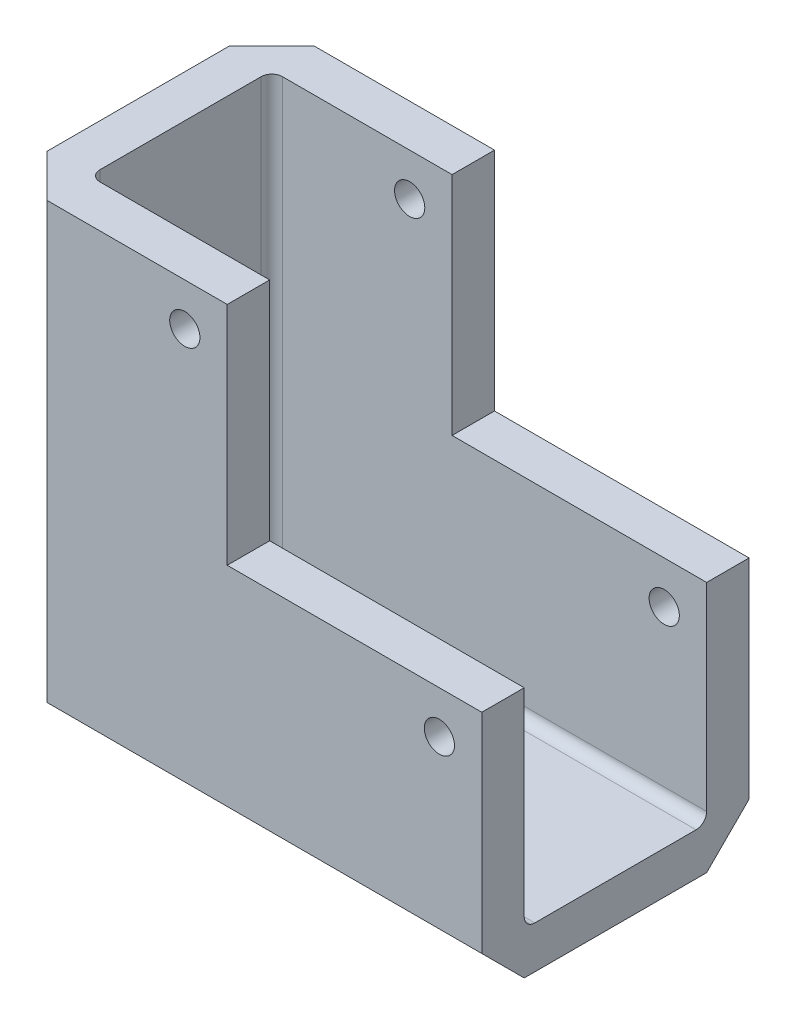
ISO-10303-21;
HEADER;
FILE_DESCRIPTION(('STEP AP214'),'2;1');
FILE_NAME('part.step','',(''),(''),'','','');
FILE_SCHEMA(('AUTOMOTIVE_DESIGN { 1 0 10303 214 1 1 1 1 }'));
ENDSEC;
DATA;
#1=APPLICATION_CONTEXT('core data for automotive mechanical design processes');
#2=APPLICATION_PROTOCOL_DEFINITION('international standard','automotive_design',2000,#1);
#3=PRODUCT_CONTEXT('',#1,'mechanical');
#4=PRODUCT('Part','Part','',(#3));
#5=PRODUCT_RELATED_PRODUCT_CATEGORY('part','',(#4));
#6=PRODUCT_DEFINITION_FORMATION('','',#4);
#7=PRODUCT_DEFINITION_CONTEXT('part definition',#1,'design');
#8=PRODUCT_DEFINITION('design','',#6,#7);
#9=PRODUCT_DEFINITION_SHAPE('','',#8);
#10=(LENGTH_UNIT() NAMED_UNIT(*) SI_UNIT(.MILLI.,.METRE.));
#11=(NAMED_UNIT(*) PLANE_ANGLE_UNIT() SI_UNIT($,.RADIAN.));
#12=(NAMED_UNIT(*) SI_UNIT($,.STERADIAN.) SOLID_ANGLE_UNIT());
#13=UNCERTAINTY_MEASURE_WITH_UNIT(LENGTH_MEASURE(1.E-05),#10,'distance_accuracy_value','');
#14=(GEOMETRIC_REPRESENTATION_CONTEXT(3) GLOBAL_UNCERTAINTY_ASSIGNED_CONTEXT((#13)) GLOBAL_UNIT_ASSIGNED_CONTEXT((#10,
#11,#12)) REPRESENTATION_CONTEXT('',''));
#15=CARTESIAN_POINT('',(0.,0.,0.));
#16=DIRECTION('',(0.,0.,1.));
#17=DIRECTION('',(1.,0.,0.));
#18=AXIS2_PLACEMENT_3D('',#15,#16,#17);
#19=CARTESIAN_POINT('',(24.,0.,4.));
#20=DIRECTION('',(0.,-1.,0.));
#21=DIRECTION('',(1.,0.,0.));
#22=AXIS2_PLACEMENT_3D('',#19,#20,#21);
#23=PLANE('',#22);
#24=DIRECTION('',(-1.,0.,0.));
#25=VECTOR('',#24,1.);
#26=CARTESIAN_POINT('',(24.,0.,0.));
#27=LINE('',#26,#25);
#28=CARTESIAN_POINT('',(24.,0.,0.));
#29=VERTEX_POINT('',#28);
#30=CARTESIAN_POINT('',(0.,0.,0.));
#31=VERTEX_POINT('',#30);
#32=EDGE_CURVE('E221',#29,#31,#27,.T.);
#33=ORIENTED_EDGE('',*,*,#32,.T.);
#34=DIRECTION('',(0.,0.,-1.));
#35=VECTOR('',#34,1.);
#36=CARTESIAN_POINT('',(0.,0.,4.));
#37=LINE('',#36,#35);
#38=CARTESIAN_POINT('',(0.,0.,4.));
#39=VERTEX_POINT('',#38);
#40=EDGE_CURVE('E249',#39,#31,#37,.T.);
#41=ORIENTED_EDGE('',*,*,#40,.F.);
#42=DIRECTION('',(-1.,0.,0.));
#43=VECTOR('',#42,1.);
#44=CARTESIAN_POINT('',(24.,0.,4.));
#45=LINE('',#44,#43);
#46=CARTESIAN_POINT('',(24.,0.,4.));
#47=VERTEX_POINT('',#46);
#48=EDGE_CURVE('E224',#47,#39,#45,.T.);
#49=ORIENTED_EDGE('',*,*,#48,.F.);
#50=DIRECTION('',(0.,0.,-1.));
#51=VECTOR('',#50,1.);
#52=CARTESIAN_POINT('',(24.,0.,4.));
#53=LINE('',#52,#51);
#54=EDGE_CURVE('E235',#47,#29,#53,.T.);
#55=ORIENTED_EDGE('',*,*,#54,.T.);
#56=EDGE_LOOP('',(#33,#41,#49,#55));
#57=FACE_BOUND('',#56,.T.);
#58=ADVANCED_FACE('F35',(#57),#23,.F.);
#59=CARTESIAN_POINT('',(0.,0.,4.));
#60=DIRECTION('',(-1.,0.,0.));
#61=DIRECTION('',(0.,-1.,0.));
#62=AXIS2_PLACEMENT_3D('',#59,#60,#61);
#63=PLANE('',#62);
#64=DIRECTION('',(0.,1.,0.));
#65=VECTOR('',#64,1.);
#66=CARTESIAN_POINT('',(0.,0.,0.));
#67=LINE('',#66,#65);
#68=CARTESIAN_POINT('',(0.,21.3,0.));
#69=VERTEX_POINT('',#68);
#70=EDGE_CURVE('E238',#31,#69,#67,.T.);
#71=ORIENTED_EDGE('',*,*,#70,.T.);
#72=DIRECTION('',(0.,0.,-1.));
#73=VECTOR('',#72,1.);
#74=CARTESIAN_POINT('',(0.,21.3,4.));
#75=LINE('',#74,#73);
#76=CARTESIAN_POINT('',(0.,21.3,4.));
#77=VERTEX_POINT('',#76);
#78=EDGE_CURVE('E246',#77,#69,#75,.T.);
#79=ORIENTED_EDGE('',*,*,#78,.F.);
#80=DIRECTION('',(0.,1.,0.));
#81=VECTOR('',#80,1.);
#82=CARTESIAN_POINT('',(0.,0.,4.));
#83=LINE('',#82,#81);
#84=EDGE_CURVE('E227',#39,#77,#83,.T.);
#85=ORIENTED_EDGE('',*,*,#84,.F.);
#86=ORIENTED_EDGE('',*,*,#40,.T.);
#87=EDGE_LOOP('',(#71,#79,#85,#86));
#88=FACE_BOUND('',#87,.T.);
#89=ADVANCED_FACE('F413',(#88),#63,.F.);
#90=CARTESIAN_POINT('',(0.,21.3,4.));
#91=DIRECTION('',(0.,-1.,0.));
#92=DIRECTION('',(1.,0.,0.));
#93=AXIS2_PLACEMENT_3D('',#90,#91,#92);
#94=PLANE('',#93);
#95=DIRECTION('',(0.,0.,-1.));
#96=VECTOR('',#95,1.);
#97=CARTESIAN_POINT('',(-21.,21.3,0.));
#98=LINE('',#97,#96);
#99=CARTESIAN_POINT('',(-21.,21.3,0.));
#100=VERTEX_POINT('',#99);
#101=CARTESIAN_POINT('',(-21.,21.3,-17.2));
#102=VERTEX_POINT('',#101);
#103=EDGE_CURVE('E218',#100,#102,#98,.T.);
#104=ORIENTED_EDGE('',*,*,#103,.F.);
#105=DIRECTION('',(0.707106781186549,0.,0.707106781186546));
#106=VECTOR('',#105,1.);
#107=CARTESIAN_POINT('',(-21.,21.3,0.));
#108=LINE('',#107,#106);
#109=CARTESIAN_POINT('',(-17.,21.3,4.));
#110=VERTEX_POINT('',#109);
#111=EDGE_CURVE('E317',#100,#110,#108,.T.);
#112=ORIENTED_EDGE('',*,*,#111,.T.);
#113=DIRECTION('',(-1.,0.,0.));
#114=VECTOR('',#113,1.);
#115=CARTESIAN_POINT('',(0.,21.3,4.));
#116=LINE('',#115,#114);
#117=EDGE_CURVE('E230',#77,#110,#116,.T.);
#118=ORIENTED_EDGE('',*,*,#117,.F.);
#119=ORIENTED_EDGE('',*,*,#78,.T.);
#120=DIRECTION('',(-1.,0.,0.));
#121=VECTOR('',#120,1.);
#122=CARTESIAN_POINT('',(0.,21.3,0.));
#123=LINE('',#122,#121);
#124=CARTESIAN_POINT('',(-16.,21.3,0.));
#125=VERTEX_POINT('',#124);
#126=EDGE_CURVE('E240',#69,#125,#123,.T.);
#127=ORIENTED_EDGE('',*,*,#126,.T.);
#128=CARTESIAN_POINT('',(-16.,21.3,-1.));
#129=DIRECTION('',(0.,-1.,0.));
#130=DIRECTION('',(1.,0.,0.));
#131=AXIS2_PLACEMENT_3D('',#128,#129,#130);
#132=CIRCLE('',#131,1.);
#133=CARTESIAN_POINT('',(-17.,21.3,-1.));
#134=VERTEX_POINT('',#133);
#135=EDGE_CURVE('E273',#125,#134,#132,.T.);
#136=ORIENTED_EDGE('',*,*,#135,.T.);
#137=DIRECTION('',(0.,0.,-1.));
#138=VECTOR('',#137,1.);
#139=CARTESIAN_POINT('',(-17.,21.3,0.));
#140=LINE('',#139,#138);
#141=CARTESIAN_POINT('',(-17.,21.3,-16.2));
#142=VERTEX_POINT('',#141);
#143=EDGE_CURVE('E215',#134,#142,#140,.T.);
#144=ORIENTED_EDGE('',*,*,#143,.T.);
#145=CARTESIAN_POINT('',(-16.,21.3,-16.2));
#146=DIRECTION('',(0.,-1.,0.));
#147=DIRECTION('',(1.,0.,0.));
#148=AXIS2_PLACEMENT_3D('',#145,#146,#147);
#149=CIRCLE('',#148,1.);
#150=CARTESIAN_POINT('',(-16.,21.3,-17.2));
#151=VERTEX_POINT('',#150);
#152=EDGE_CURVE('E275',#142,#151,#149,.T.);
#153=ORIENTED_EDGE('',*,*,#152,.T.);
#154=DIRECTION('',(1.,0.,0.));
#155=VECTOR('',#154,1.);
#156=CARTESIAN_POINT('',(0.,21.3,-17.2));
#157=LINE('',#156,#155);
#158=CARTESIAN_POINT('',(0.,21.3,-17.2));
#159=VERTEX_POINT('',#158);
#160=EDGE_CURVE('E181',#151,#159,#157,.T.);
#161=ORIENTED_EDGE('',*,*,#160,.T.);
#162=DIRECTION('',(0.,0.,1.));
#163=VECTOR('',#162,1.);
#164=CARTESIAN_POINT('',(0.,21.3,-21.2));
#165=LINE('',#164,#163);
#166=CARTESIAN_POINT('',(0.,21.3,-21.2));
#167=VERTEX_POINT('',#166);
#168=EDGE_CURVE('E177',#167,#159,#165,.T.);
#169=ORIENTED_EDGE('',*,*,#168,.F.);
#170=DIRECTION('',(1.,0.,0.));
#171=VECTOR('',#170,1.);
#172=CARTESIAN_POINT('',(0.,21.3,-21.2));
#173=LINE('',#172,#171);
#174=CARTESIAN_POINT('',(-17.,21.3,-21.2));
#175=VERTEX_POINT('',#174);
#176=EDGE_CURVE('E165',#175,#167,#173,.T.);
#177=ORIENTED_EDGE('',*,*,#176,.F.);
#178=DIRECTION('',(-0.707106781186546,0.,0.707106781186549));
#179=VECTOR('',#178,1.);
#180=CARTESIAN_POINT('',(-17.,21.3,-21.2));
#181=LINE('',#180,#179);
#182=EDGE_CURVE('E315',#175,#102,#181,.T.);
#183=ORIENTED_EDGE('',*,*,#182,.T.);
#184=EDGE_LOOP('',(#104,#112,#118,#119,#127,#136,#144,#153,#161,#169,#177,#183));
#185=FACE_BOUND('',#184,.T.);
#186=ADVANCED_FACE('F179',(#185),#94,.F.);
#187=CARTESIAN_POINT('',(24.,-19.7,4.));
#188=DIRECTION('',(-1.,0.,0.));
#189=DIRECTION('',(0.,-1.,0.));
#190=AXIS2_PLACEMENT_3D('',#187,#188,#189);
#191=PLANE('',#190);
#192=DIRECTION('',(0.,1.,0.));
#193=VECTOR('',#192,1.);
#194=CARTESIAN_POINT('',(24.,-19.7,4.));
#195=LINE('',#194,#193);
#196=CARTESIAN_POINT('',(24.,-19.7,4.));
#197=VERTEX_POINT('',#196);
#198=EDGE_CURVE('E233',#197,#47,#195,.T.);
#199=ORIENTED_EDGE('',*,*,#198,.F.);
#200=DIRECTION('',(0.,0.707106781186549,0.707106781186546));
#201=VECTOR('',#200,1.);
#202=CARTESIAN_POINT('',(24.,-23.7,0.));
#203=LINE('',#202,#201);
#204=CARTESIAN_POINT('',(24.,-23.7,0.));
#205=VERTEX_POINT('',#204);
#206=EDGE_CURVE('E309',#197,#205,#203,.F.);
#207=ORIENTED_EDGE('',*,*,#206,.T.);
#208=DIRECTION('',(0.,0.,1.));
#209=VECTOR('',#208,1.);
#210=CARTESIAN_POINT('',(24.,-23.7,-17.2));
#211=LINE('',#210,#209);
#212=CARTESIAN_POINT('',(24.,-23.7,-17.2));
#213=VERTEX_POINT('',#212);
#214=EDGE_CURVE('E212',#213,#205,#211,.T.);
#215=ORIENTED_EDGE('',*,*,#214,.F.);
#216=DIRECTION('',(0.,-0.707106781186546,0.707106781186549));
#217=VECTOR('',#216,1.);
#218=CARTESIAN_POINT('',(24.,-19.7,-21.2));
#219=LINE('',#218,#217);
#220=CARTESIAN_POINT('',(24.,-19.7,-21.2));
#221=VERTEX_POINT('',#220);
#222=EDGE_CURVE('E307',#213,#221,#219,.F.);
#223=ORIENTED_EDGE('',*,*,#222,.T.);
#224=DIRECTION('',(0.,-1.,0.));
#225=VECTOR('',#224,1.);
#226=CARTESIAN_POINT('',(24.,-23.7,-21.2));
#227=LINE('',#226,#225);
#228=CARTESIAN_POINT('',(24.,0.,-21.2));
#229=VERTEX_POINT('',#228);
#230=EDGE_CURVE('E192',#229,#221,#227,.T.);
#231=ORIENTED_EDGE('',*,*,#230,.F.);
#232=DIRECTION('',(0.,0.,1.));
#233=VECTOR('',#232,1.);
#234=CARTESIAN_POINT('',(24.,0.,-21.2));
#235=LINE('',#234,#233);
#236=CARTESIAN_POINT('',(24.,0.,-17.2));
#237=VERTEX_POINT('',#236);
#238=EDGE_CURVE('E197',#229,#237,#235,.T.);
#239=ORIENTED_EDGE('',*,*,#238,.T.);
#240=DIRECTION('',(0.,-1.,0.));
#241=VECTOR('',#240,1.);
#242=CARTESIAN_POINT('',(24.,-23.7,-17.2));
#243=LINE('',#242,#241);
#244=CARTESIAN_POINT('',(24.,-18.7,-17.2));
#245=VERTEX_POINT('',#244);
#246=EDGE_CURVE('E174',#237,#245,#243,.T.);
#247=ORIENTED_EDGE('',*,*,#246,.T.);
#248=CARTESIAN_POINT('',(24.,-18.7,-16.2));
#249=DIRECTION('',(-1.,0.,0.));
#250=DIRECTION('',(0.,-1.,0.));
#251=AXIS2_PLACEMENT_3D('',#248,#249,#250);
#252=CIRCLE('',#251,1.);
#253=CARTESIAN_POINT('',(24.,-19.7,-16.2));
#254=VERTEX_POINT('',#253);
#255=EDGE_CURVE('E277',#245,#254,#252,.T.);
#256=ORIENTED_EDGE('',*,*,#255,.T.);
#257=DIRECTION('',(0.,0.,1.));
#258=VECTOR('',#257,1.);
#259=CARTESIAN_POINT('',(24.,-19.7,-17.2));
#260=LINE('',#259,#258);
#261=CARTESIAN_POINT('',(24.,-19.7,-1.));
#262=VERTEX_POINT('',#261);
#263=EDGE_CURVE('E184',#254,#262,#260,.T.);
#264=ORIENTED_EDGE('',*,*,#263,.T.);
#265=CARTESIAN_POINT('',(24.,-18.7,-1.));
#266=DIRECTION('',(-1.,0.,0.));
#267=DIRECTION('',(0.,-1.,0.));
#268=AXIS2_PLACEMENT_3D('',#265,#266,#267);
#269=CIRCLE('',#268,1.);
#270=CARTESIAN_POINT('',(24.,-18.7,0.));
#271=VERTEX_POINT('',#270);
#272=EDGE_CURVE('E279',#262,#271,#269,.T.);
#273=ORIENTED_EDGE('',*,*,#272,.T.);
#274=DIRECTION('',(0.,1.,0.));
#275=VECTOR('',#274,1.);
#276=CARTESIAN_POINT('',(24.,-19.7,0.));
#277=LINE('',#276,#275);
#278=EDGE_CURVE('E228',#271,#29,#277,.T.);
#279=ORIENTED_EDGE('',*,*,#278,.T.);
#280=ORIENTED_EDGE('',*,*,#54,.F.);
#281=EDGE_LOOP('',(#199,#207,#215,#223,#231,#239,#247,#256,#264,#273,#279,#280));
#282=FACE_BOUND('',#281,.T.);
#283=ADVANCED_FACE('F377',(#282),#191,.F.);
#284=CARTESIAN_POINT('',(0.,0.,4.));
#285=DIRECTION('',(0.,0.,-1.));
#286=DIRECTION('',(-1.,0.,0.));
#287=AXIS2_PLACEMENT_3D('',#284,#285,#286);
#288=PLANE('',#287);
#289=CARTESIAN_POINT('',(20.,-4.,4.));
#290=DIRECTION('',(0.,0.,-1.));
#291=DIRECTION('',(0.,1.,0.));
#292=AXIS2_PLACEMENT_3D('',#289,#290,#291);
#293=CIRCLE('',#292,1.425);
#294=CARTESIAN_POINT('',(20.,-2.575,4.));
#295=VERTEX_POINT('',#294);
#296=EDGE_CURVE('E325',#295,#295,#293,.T.);
#297=ORIENTED_EDGE('',*,*,#296,.T.);
#298=EDGE_LOOP('',(#297));
#299=FACE_BOUND('',#298,.T.);
#300=CARTESIAN_POINT('',(-4.00000000000001,17.3,4.));
#301=DIRECTION('',(0.,0.,-1.));
#302=DIRECTION('',(0.,1.,0.));
#303=AXIS2_PLACEMENT_3D('',#300,#301,#302);
#304=CIRCLE('',#303,1.425);
#305=CARTESIAN_POINT('',(-4.00000000000001,18.725,4.));
#306=VERTEX_POINT('',#305);
#307=EDGE_CURVE('E336',#306,#306,#304,.T.);
#308=ORIENTED_EDGE('',*,*,#307,.T.);
#309=EDGE_LOOP('',(#308));
#310=FACE_BOUND('',#309,.T.);
#311=DIRECTION('',(0.,-1.,0.));
#312=VECTOR('',#311,1.);
#313=CARTESIAN_POINT('',(-17.,-23.7,4.));
#314=LINE('',#313,#312);
#315=CARTESIAN_POINT('',(-17.,-19.7,4.));
#316=VERTEX_POINT('',#315);
#317=EDGE_CURVE('E303',#110,#316,#314,.T.);
#318=ORIENTED_EDGE('',*,*,#317,.T.);
#319=DIRECTION('',(1.,0.,0.));
#320=VECTOR('',#319,1.);
#321=CARTESIAN_POINT('',(0.,-19.7,4.));
#322=LINE('',#321,#320);
#323=EDGE_CURVE('E305',#316,#197,#322,.T.);
#324=ORIENTED_EDGE('',*,*,#323,.T.);
#325=ORIENTED_EDGE('',*,*,#198,.T.);
#326=ORIENTED_EDGE('',*,*,#48,.T.);
#327=ORIENTED_EDGE('',*,*,#84,.T.);
#328=ORIENTED_EDGE('',*,*,#117,.T.);
#329=EDGE_LOOP('',(#318,#324,#325,#326,#327,#328));
#330=FACE_BOUND('',#329,.T.);
#331=ADVANCED_FACE('F472',(#299,#310,#330),#288,.F.);
#332=CARTESIAN_POINT('',(0.,0.,0.));
#333=DIRECTION('',(0.,0.,-1.));
#334=DIRECTION('',(-1.,0.,0.));
#335=AXIS2_PLACEMENT_3D('',#332,#333,#334);
#336=PLANE('',#335);
#337=CARTESIAN_POINT('',(20.,-4.,0.));
#338=DIRECTION('',(0.,0.,-1.));
#339=DIRECTION('',(-1.,0.,0.));
#340=AXIS2_PLACEMENT_3D('',#337,#338,#339);
#341=CIRCLE('',#340,1.425);
#342=CARTESIAN_POINT('',(18.575,-4.,0.));
#343=VERTEX_POINT('',#342);
#344=EDGE_CURVE('E321',#343,#343,#341,.T.);
#345=ORIENTED_EDGE('',*,*,#344,.F.);
#346=EDGE_LOOP('',(#345));
#347=FACE_BOUND('',#346,.T.);
#348=CARTESIAN_POINT('',(-4.00000000000001,17.3,0.));
#349=DIRECTION('',(0.,0.,-1.));
#350=DIRECTION('',(-1.,0.,0.));
#351=AXIS2_PLACEMENT_3D('',#348,#349,#350);
#352=CIRCLE('',#351,1.425);
#353=CARTESIAN_POINT('',(-5.42500000000001,17.3,0.));
#354=VERTEX_POINT('',#353);
#355=EDGE_CURVE('E324',#354,#354,#352,.T.);
#356=ORIENTED_EDGE('',*,*,#355,.F.);
#357=EDGE_LOOP('',(#356));
#358=FACE_BOUND('',#357,.T.);
#359=DIRECTION('',(1.,0.,0.));
#360=VECTOR('',#359,1.);
#361=CARTESIAN_POINT('',(-17.,-18.7,0.));
#362=LINE('',#361,#360);
#363=CARTESIAN_POINT('',(-16.,-18.7,0.));
#364=VERTEX_POINT('',#363);
#365=EDGE_CURVE('E259',#271,#364,#362,.F.);
#366=ORIENTED_EDGE('',*,*,#365,.T.);
#367=DIRECTION('',(0.,-1.,0.));
#368=VECTOR('',#367,1.);
#369=CARTESIAN_POINT('',(-16.,0.,0.));
#370=LINE('',#369,#368);
#371=EDGE_CURVE('E261',#364,#125,#370,.F.);
#372=ORIENTED_EDGE('',*,*,#371,.T.);
#373=ORIENTED_EDGE('',*,*,#126,.F.);
#374=ORIENTED_EDGE('',*,*,#70,.F.);
#375=ORIENTED_EDGE('',*,*,#32,.F.);
#376=ORIENTED_EDGE('',*,*,#278,.F.);
#377=EDGE_LOOP('',(#366,#372,#373,#374,#375,#376));
#378=FACE_BOUND('',#377,.T.);
#379=ADVANCED_FACE('F477',(#347,#358,#378),#336,.T.);
#380=CARTESIAN_POINT('',(-17.,0.,0.));
#381=DIRECTION('',(-1.,0.,0.));
#382=DIRECTION('',(0.,-1.,0.));
#383=AXIS2_PLACEMENT_3D('',#380,#381,#382);
#384=PLANE('',#383);
#385=ORIENTED_EDGE('',*,*,#143,.F.);
#386=DIRECTION('',(0.,-1.,0.));
#387=VECTOR('',#386,1.);
#388=CARTESIAN_POINT('',(-17.,0.,-1.));
#389=LINE('',#388,#387);
#390=CARTESIAN_POINT('',(-17.,-18.7,-1.));
#391=VERTEX_POINT('',#390);
#392=EDGE_CURVE('E256',#134,#391,#389,.T.);
#393=ORIENTED_EDGE('',*,*,#392,.T.);
#394=DIRECTION('',(0.,0.,-1.));
#395=VECTOR('',#394,1.);
#396=CARTESIAN_POINT('',(-17.,-18.7,0.));
#397=LINE('',#396,#395);
#398=CARTESIAN_POINT('',(-17.,-18.7,-16.2));
#399=VERTEX_POINT('',#398);
#400=EDGE_CURVE('E252',#391,#399,#397,.T.);
#401=ORIENTED_EDGE('',*,*,#400,.T.);
#402=DIRECTION('',(0.,-1.,0.));
#403=VECTOR('',#402,1.);
#404=CARTESIAN_POINT('',(-17.,0.,-16.2));
#405=LINE('',#404,#403);
#406=EDGE_CURVE('E254',#399,#142,#405,.F.);
#407=ORIENTED_EDGE('',*,*,#406,.T.);
#408=EDGE_LOOP('',(#385,#393,#401,#407));
#409=FACE_BOUND('',#408,.T.);
#410=ADVANCED_FACE('F490',(#409),#384,.F.);
#411=CARTESIAN_POINT('',(-21.,0.,0.));
#412=DIRECTION('',(-1.,0.,0.));
#413=DIRECTION('',(0.,-1.,0.));
#414=AXIS2_PLACEMENT_3D('',#411,#412,#413);
#415=PLANE('',#414);
#416=DIRECTION('',(0.,0.,-1.));
#417=VECTOR('',#416,1.);
#418=CARTESIAN_POINT('',(-21.,-23.7,-17.2));
#419=LINE('',#418,#417);
#420=CARTESIAN_POINT('',(-21.,-23.7,0.));
#421=VERTEX_POINT('',#420);
#422=CARTESIAN_POINT('',(-21.,-23.7,-17.2));
#423=VERTEX_POINT('',#422);
#424=EDGE_CURVE('E209',#421,#423,#419,.T.);
#425=ORIENTED_EDGE('',*,*,#424,.F.);
#426=DIRECTION('',(0.,1.,0.));
#427=VECTOR('',#426,1.);
#428=CARTESIAN_POINT('',(-21.,21.3,0.));
#429=LINE('',#428,#427);
#430=EDGE_CURVE('E313',#421,#100,#429,.T.);
#431=ORIENTED_EDGE('',*,*,#430,.T.);
#432=ORIENTED_EDGE('',*,*,#103,.T.);
#433=DIRECTION('',(0.,-1.,0.));
#434=VECTOR('',#433,1.);
#435=CARTESIAN_POINT('',(-21.,-23.7,-17.2));
#436=LINE('',#435,#434);
#437=EDGE_CURVE('E311',#102,#423,#436,.T.);
#438=ORIENTED_EDGE('',*,*,#437,.T.);
#439=EDGE_LOOP('',(#425,#431,#432,#438));
#440=FACE_BOUND('',#439,.T.);
#441=ADVANCED_FACE('F401',(#440),#415,.T.);
#442=CARTESIAN_POINT('',(0.,-23.7,0.));
#443=DIRECTION('',(0.,1.,0.));
#444=DIRECTION('',(-1.,0.,0.));
#445=AXIS2_PLACEMENT_3D('',#442,#443,#444);
#446=PLANE('',#445);
#447=ORIENTED_EDGE('',*,*,#214,.T.);
#448=DIRECTION('',(-1.,0.,0.));
#449=VECTOR('',#448,1.);
#450=CARTESIAN_POINT('',(0.,-23.7,0.));
#451=LINE('',#450,#449);
#452=EDGE_CURVE('E300',#205,#421,#451,.T.);
#453=ORIENTED_EDGE('',*,*,#452,.T.);
#454=ORIENTED_EDGE('',*,*,#424,.T.);
#455=DIRECTION('',(1.,0.,0.));
#456=VECTOR('',#455,1.);
#457=CARTESIAN_POINT('',(0.,-23.7,-17.2));
#458=LINE('',#457,#456);
#459=EDGE_CURVE('E281',#423,#213,#458,.T.);
#460=ORIENTED_EDGE('',*,*,#459,.T.);
#461=EDGE_LOOP('',(#447,#453,#454,#460));
#462=FACE_BOUND('',#461,.T.);
#463=ADVANCED_FACE('F389',(#462),#446,.F.);
#464=CARTESIAN_POINT('',(0.,-19.7,0.));
#465=DIRECTION('',(0.,1.,0.));
#466=DIRECTION('',(-1.,0.,0.));
#467=AXIS2_PLACEMENT_3D('',#464,#465,#466);
#468=PLANE('',#467);
#469=ORIENTED_EDGE('',*,*,#263,.F.);
#470=DIRECTION('',(1.,0.,0.));
#471=VECTOR('',#470,1.);
#472=CARTESIAN_POINT('',(-17.,-19.7,-16.2));
#473=LINE('',#472,#471);
#474=CARTESIAN_POINT('',(-16.,-19.7,-16.2));
#475=VERTEX_POINT('',#474);
#476=EDGE_CURVE('E271',#254,#475,#473,.F.);
#477=ORIENTED_EDGE('',*,*,#476,.T.);
#478=DIRECTION('',(0.,0.,-1.));
#479=VECTOR('',#478,1.);
#480=CARTESIAN_POINT('',(-16.,-19.7,0.));
#481=LINE('',#480,#479);
#482=CARTESIAN_POINT('',(-16.,-19.7,-1.));
#483=VERTEX_POINT('',#482);
#484=EDGE_CURVE('E267',#475,#483,#481,.F.);
#485=ORIENTED_EDGE('',*,*,#484,.T.);
#486=DIRECTION('',(1.,0.,0.));
#487=VECTOR('',#486,1.);
#488=CARTESIAN_POINT('',(24.,-19.7,-1.));
#489=LINE('',#488,#487);
#490=EDGE_CURVE('E269',#483,#262,#489,.T.);
#491=ORIENTED_EDGE('',*,*,#490,.T.);
#492=EDGE_LOOP('',(#469,#477,#485,#491));
#493=FACE_BOUND('',#492,.T.);
#494=ADVANCED_FACE('F552',(#493),#468,.T.);
#495=CARTESIAN_POINT('',(0.,0.,-21.2));
#496=DIRECTION('',(-1.,0.,0.));
#497=DIRECTION('',(0.,-1.,0.));
#498=AXIS2_PLACEMENT_3D('',#495,#496,#497);
#499=PLANE('',#498);
#500=DIRECTION('',(0.,-1.,0.));
#501=VECTOR('',#500,1.);
#502=CARTESIAN_POINT('',(0.,0.,-17.2));
#503=LINE('',#502,#501);
#504=CARTESIAN_POINT('',(0.,0.,-17.2));
#505=VERTEX_POINT('',#504);
#506=EDGE_CURVE('E199',#159,#505,#503,.T.);
#507=ORIENTED_EDGE('',*,*,#506,.T.);
#508=DIRECTION('',(0.,0.,1.));
#509=VECTOR('',#508,1.);
#510=CARTESIAN_POINT('',(0.,0.,-21.2));
#511=LINE('',#510,#509);
#512=CARTESIAN_POINT('',(0.,0.,-21.2));
#513=VERTEX_POINT('',#512);
#514=EDGE_CURVE('E185',#513,#505,#511,.T.);
#515=ORIENTED_EDGE('',*,*,#514,.F.);
#516=DIRECTION('',(0.,-1.,0.));
#517=VECTOR('',#516,1.);
#518=CARTESIAN_POINT('',(0.,0.,-21.2));
#519=LINE('',#518,#517);
#520=EDGE_CURVE('E170',#167,#513,#519,.T.);
#521=ORIENTED_EDGE('',*,*,#520,.F.);
#522=ORIENTED_EDGE('',*,*,#168,.T.);
#523=EDGE_LOOP('',(#507,#515,#521,#522));
#524=FACE_BOUND('',#523,.T.);
#525=ADVANCED_FACE('F187',(#524),#499,.F.);
#526=CARTESIAN_POINT('',(24.,0.,-21.2));
#527=DIRECTION('',(0.,-1.,0.));
#528=DIRECTION('',(0.,0.,-1.));
#529=AXIS2_PLACEMENT_3D('',#526,#527,#528);
#530=PLANE('',#529);
#531=DIRECTION('',(1.,0.,0.));
#532=VECTOR('',#531,1.);
#533=CARTESIAN_POINT('',(24.,0.,-17.2));
#534=LINE('',#533,#532);
#535=EDGE_CURVE('E202',#505,#237,#534,.T.);
#536=ORIENTED_EDGE('',*,*,#535,.T.);
#537=ORIENTED_EDGE('',*,*,#238,.F.);
#538=DIRECTION('',(1.,0.,0.));
#539=VECTOR('',#538,1.);
#540=CARTESIAN_POINT('',(24.,0.,-21.2));
#541=LINE('',#540,#539);
#542=EDGE_CURVE('E190',#513,#229,#541,.T.);
#543=ORIENTED_EDGE('',*,*,#542,.F.);
#544=ORIENTED_EDGE('',*,*,#514,.T.);
#545=EDGE_LOOP('',(#536,#537,#543,#544));
#546=FACE_BOUND('',#545,.T.);
#547=ADVANCED_FACE('F382',(#546),#530,.F.);
#548=CARTESIAN_POINT('',(0.,0.,-21.2));
#549=DIRECTION('',(0.,0.,1.));
#550=DIRECTION('',(0.,-1.,0.));
#551=AXIS2_PLACEMENT_3D('',#548,#549,#550);
#552=PLANE('',#551);
#553=CARTESIAN_POINT('',(20.,-4.,-21.2));
#554=DIRECTION('',(0.,0.,-1.));
#555=DIRECTION('',(0.,1.,0.));
#556=AXIS2_PLACEMENT_3D('',#553,#554,#555);
#557=CIRCLE('',#556,1.425);
#558=CARTESIAN_POINT('',(20.,-2.575,-21.2));
#559=VERTEX_POINT('',#558);
#560=EDGE_CURVE('E331',#559,#559,#557,.T.);
#561=ORIENTED_EDGE('',*,*,#560,.F.);
#562=EDGE_LOOP('',(#561));
#563=FACE_BOUND('',#562,.T.);
#564=CARTESIAN_POINT('',(-4.00000000000001,17.3,-21.2));
#565=DIRECTION('',(0.,0.,-1.));
#566=DIRECTION('',(0.,1.,0.));
#567=AXIS2_PLACEMENT_3D('',#564,#565,#566);
#568=CIRCLE('',#567,1.425);
#569=CARTESIAN_POINT('',(-4.00000000000001,18.725,-21.2));
#570=VERTEX_POINT('',#569);
#571=EDGE_CURVE('E341',#570,#570,#568,.T.);
#572=ORIENTED_EDGE('',*,*,#571,.F.);
#573=EDGE_LOOP('',(#572));
#574=FACE_BOUND('',#573,.T.);
#575=ORIENTED_EDGE('',*,*,#230,.T.);
#576=DIRECTION('',(-1.,0.,0.));
#577=VECTOR('',#576,1.);
#578=CARTESIAN_POINT('',(0.,-19.7,-21.2));
#579=LINE('',#578,#577);
#580=CARTESIAN_POINT('',(-17.,-19.7,-21.2));
#581=VERTEX_POINT('',#580);
#582=EDGE_CURVE('E11',#221,#581,#579,.T.);
#583=ORIENTED_EDGE('',*,*,#582,.T.);
#584=DIRECTION('',(0.,1.,0.));
#585=VECTOR('',#584,1.);
#586=CARTESIAN_POINT('',(-17.,21.3,-21.2));
#587=LINE('',#586,#585);
#588=EDGE_CURVE('E44',#581,#175,#587,.T.);
#589=ORIENTED_EDGE('',*,*,#588,.T.);
#590=ORIENTED_EDGE('',*,*,#176,.T.);
#591=ORIENTED_EDGE('',*,*,#520,.T.);
#592=ORIENTED_EDGE('',*,*,#542,.T.);
#593=EDGE_LOOP('',(#575,#583,#589,#590,#591,#592));
#594=FACE_BOUND('',#593,.T.);
#595=ADVANCED_FACE('F168',(#563,#574,#594),#552,.F.);
#596=CARTESIAN_POINT('',(0.,0.,-17.2));
#597=DIRECTION('',(0.,0.,1.));
#598=DIRECTION('',(0.,-1.,0.));
#599=AXIS2_PLACEMENT_3D('',#596,#597,#598);
#600=PLANE('',#599);
#601=CARTESIAN_POINT('',(20.,-4.,-17.2));
#602=DIRECTION('',(0.,0.,1.));
#603=DIRECTION('',(0.,-1.,0.));
#604=AXIS2_PLACEMENT_3D('',#601,#602,#603);
#605=CIRCLE('',#604,1.425);
#606=CARTESIAN_POINT('',(20.,-5.425,-17.2));
#607=VERTEX_POINT('',#606);
#608=EDGE_CURVE('E39',#607,#607,#605,.T.);
#609=ORIENTED_EDGE('',*,*,#608,.F.);
#610=EDGE_LOOP('',(#609));
#611=FACE_BOUND('',#610,.T.);
#612=CARTESIAN_POINT('',(-4.00000000000001,17.3,-17.2));
#613=DIRECTION('',(0.,0.,1.));
#614=DIRECTION('',(0.,-1.,0.));
#615=AXIS2_PLACEMENT_3D('',#612,#613,#614);
#616=CIRCLE('',#615,1.425);
#617=CARTESIAN_POINT('',(-4.00000000000001,15.875,-17.2));
#618=VERTEX_POINT('',#617);
#619=EDGE_CURVE('E322',#618,#618,#616,.T.);
#620=ORIENTED_EDGE('',*,*,#619,.F.);
#621=EDGE_LOOP('',(#620));
#622=FACE_BOUND('',#621,.T.);
#623=ORIENTED_EDGE('',*,*,#160,.F.);
#624=DIRECTION('',(0.,-1.,0.));
#625=VECTOR('',#624,1.);
#626=CARTESIAN_POINT('',(-16.,0.,-17.2));
#627=LINE('',#626,#625);
#628=CARTESIAN_POINT('',(-16.,-18.7,-17.2));
#629=VERTEX_POINT('',#628);
#630=EDGE_CURVE('E265',#151,#629,#627,.T.);
#631=ORIENTED_EDGE('',*,*,#630,.T.);
#632=DIRECTION('',(1.,0.,0.));
#633=VECTOR('',#632,1.);
#634=CARTESIAN_POINT('',(24.,-18.7,-17.2));
#635=LINE('',#634,#633);
#636=EDGE_CURVE('E263',#629,#245,#635,.T.);
#637=ORIENTED_EDGE('',*,*,#636,.T.);
#638=ORIENTED_EDGE('',*,*,#246,.F.);
#639=ORIENTED_EDGE('',*,*,#535,.F.);
#640=ORIENTED_EDGE('',*,*,#506,.F.);
#641=EDGE_LOOP('',(#623,#631,#637,#638,#639,#640));
#642=FACE_BOUND('',#641,.T.);
#643=ADVANCED_FACE('F352',(#611,#622,#642),#600,.T.);
#644=CARTESIAN_POINT('',(-16.,0.,-16.2));
#645=DIRECTION('',(0.,-1.,0.));
#646=DIRECTION('',(1.,0.,0.));
#647=AXIS2_PLACEMENT_3D('',#644,#645,#646);
#648=CYLINDRICAL_SURFACE('',#647,1.);
#649=ORIENTED_EDGE('',*,*,#152,.F.);
#650=ORIENTED_EDGE('',*,*,#406,.F.);
#651=CARTESIAN_POINT('',(-16.,-18.7,-16.2));
#652=DIRECTION('',(0.,1.,0.));
#653=DIRECTION('',(0.,0.,1.));
#654=AXIS2_PLACEMENT_3D('',#651,#652,#653);
#655=CIRCLE('',#654,1.);
#656=EDGE_CURVE('E200',#629,#399,#655,.T.);
#657=ORIENTED_EDGE('',*,*,#656,.F.);
#658=ORIENTED_EDGE('',*,*,#630,.F.);
#659=EDGE_LOOP('',(#649,#650,#657,#658));
#660=FACE_BOUND('',#659,.T.);
#661=ADVANCED_FACE('F355',(#660),#648,.F.);
#662=CARTESIAN_POINT('',(0.,-18.7,-16.2));
#663=DIRECTION('',(-1.,0.,0.));
#664=DIRECTION('',(0.,-1.,0.));
#665=AXIS2_PLACEMENT_3D('',#662,#663,#664);
#666=CYLINDRICAL_SURFACE('',#665,1.);
#667=ORIENTED_EDGE('',*,*,#255,.F.);
#668=ORIENTED_EDGE('',*,*,#636,.F.);
#669=CARTESIAN_POINT('',(-16.,-18.7,-16.2));
#670=DIRECTION('',(1.,0.,0.));
#671=DIRECTION('',(0.,0.,-1.));
#672=AXIS2_PLACEMENT_3D('',#669,#670,#671);
#673=CIRCLE('',#672,1.);
#674=EDGE_CURVE('E294',#475,#629,#673,.T.);
#675=ORIENTED_EDGE('',*,*,#674,.F.);
#676=ORIENTED_EDGE('',*,*,#476,.F.);
#677=EDGE_LOOP('',(#667,#668,#675,#676));
#678=FACE_BOUND('',#677,.T.);
#679=ADVANCED_FACE('F373',(#678),#666,.F.);
#680=CARTESIAN_POINT('',(-16.,-18.7,-16.2));
#681=DIRECTION('',(0.,0.,1.));
#682=DIRECTION('',(1.,0.,0.));
#683=AXIS2_PLACEMENT_3D('',#680,#681,#682);
#684=SPHERICAL_SURFACE('',#683,1.);
#685=ORIENTED_EDGE('',*,*,#674,.T.);
#686=ORIENTED_EDGE('',*,*,#656,.T.);
#687=CARTESIAN_POINT('',(-16.,-18.7,-16.2));
#688=DIRECTION('',(0.,0.,1.));
#689=DIRECTION('',(1.,0.,0.));
#690=AXIS2_PLACEMENT_3D('',#687,#688,#689);
#691=CIRCLE('',#690,1.);
#692=EDGE_CURVE('E291',#475,#399,#691,.F.);
#693=ORIENTED_EDGE('',*,*,#692,.F.);
#694=EDGE_LOOP('',(#685,#686,#693));
#695=FACE_BOUND('',#694,.T.);
#696=ADVANCED_FACE('F368',(#695),#684,.F.);
#697=CARTESIAN_POINT('',(-16.,-18.7,0.));
#698=DIRECTION('',(0.,0.,-1.));
#699=DIRECTION('',(-1.,0.,0.));
#700=AXIS2_PLACEMENT_3D('',#697,#698,#699);
#701=CYLINDRICAL_SURFACE('',#700,1.);
#702=ORIENTED_EDGE('',*,*,#692,.T.);
#703=ORIENTED_EDGE('',*,*,#400,.F.);
#704=CARTESIAN_POINT('',(-16.,-18.7,-1.));
#705=DIRECTION('',(0.,0.,-1.));
#706=DIRECTION('',(-1.,0.,0.));
#707=AXIS2_PLACEMENT_3D('',#704,#705,#706);
#708=CIRCLE('',#707,1.);
#709=EDGE_CURVE('E288',#483,#391,#708,.T.);
#710=ORIENTED_EDGE('',*,*,#709,.F.);
#711=ORIENTED_EDGE('',*,*,#484,.F.);
#712=EDGE_LOOP('',(#702,#703,#710,#711));
#713=FACE_BOUND('',#712,.T.);
#714=ADVANCED_FACE('F434',(#713),#701,.F.);
#715=CARTESIAN_POINT('',(0.,-18.7,-1.));
#716=DIRECTION('',(-1.,0.,0.));
#717=DIRECTION('',(0.,-1.,0.));
#718=AXIS2_PLACEMENT_3D('',#715,#716,#717);
#719=CYLINDRICAL_SURFACE('',#718,1.);
#720=ORIENTED_EDGE('',*,*,#272,.F.);
#721=ORIENTED_EDGE('',*,*,#490,.F.);
#722=CARTESIAN_POINT('',(-16.,-18.7,-1.));
#723=DIRECTION('',(1.,0.,0.));
#724=DIRECTION('',(0.,0.,-1.));
#725=AXIS2_PLACEMENT_3D('',#722,#723,#724);
#726=CIRCLE('',#725,1.);
#727=EDGE_CURVE('E284',#364,#483,#726,.T.);
#728=ORIENTED_EDGE('',*,*,#727,.F.);
#729=ORIENTED_EDGE('',*,*,#365,.F.);
#730=EDGE_LOOP('',(#720,#721,#728,#729));
#731=FACE_BOUND('',#730,.T.);
#732=ADVANCED_FACE('F430',(#731),#719,.F.);
#733=CARTESIAN_POINT('',(-16.,-18.7,-1.));
#734=DIRECTION('',(0.,0.,1.));
#735=DIRECTION('',(1.,0.,0.));
#736=AXIS2_PLACEMENT_3D('',#733,#734,#735);
#737=SPHERICAL_SURFACE('',#736,1.);
#738=ORIENTED_EDGE('',*,*,#727,.T.);
#739=ORIENTED_EDGE('',*,*,#709,.T.);
#740=CARTESIAN_POINT('',(-16.,-18.7,-1.));
#741=DIRECTION('',(0.,1.,0.));
#742=DIRECTION('',(0.,0.,1.));
#743=AXIS2_PLACEMENT_3D('',#740,#741,#742);
#744=CIRCLE('',#743,1.);
#745=EDGE_CURVE('E282',#364,#391,#744,.F.);
#746=ORIENTED_EDGE('',*,*,#745,.F.);
#747=EDGE_LOOP('',(#738,#739,#746));
#748=FACE_BOUND('',#747,.T.);
#749=ADVANCED_FACE('F426',(#748),#737,.F.);
#750=CARTESIAN_POINT('',(-16.,0.,-1.));
#751=DIRECTION('',(0.,-1.,0.));
#752=DIRECTION('',(1.,0.,0.));
#753=AXIS2_PLACEMENT_3D('',#750,#751,#752);
#754=CYLINDRICAL_SURFACE('',#753,1.);
#755=ORIENTED_EDGE('',*,*,#135,.F.);
#756=ORIENTED_EDGE('',*,*,#371,.F.);
#757=ORIENTED_EDGE('',*,*,#745,.T.);
#758=ORIENTED_EDGE('',*,*,#392,.F.);
#759=EDGE_LOOP('',(#755,#756,#757,#758));
#760=FACE_BOUND('',#759,.T.);
#761=ADVANCED_FACE('F423',(#760),#754,.F.);
#762=CARTESIAN_POINT('',(-21.,0.,0.));
#763=DIRECTION('',(-0.707106781186546,0.,0.707106781186549));
#764=DIRECTION('',(0.,-1.,0.));
#765=AXIS2_PLACEMENT_3D('',#762,#763,#764);
#766=PLANE('',#765);
#767=ORIENTED_EDGE('',*,*,#111,.F.);
#768=ORIENTED_EDGE('',*,*,#430,.F.);
#769=DIRECTION('',(-0.577350269189626,-0.577350269189627,-0.577350269189624));
#770=VECTOR('',#769,1.);
#771=CARTESIAN_POINT('',(-13.1,-15.8,7.89999999999999));
#772=LINE('',#771,#770);
#773=EDGE_CURVE('E285',#316,#421,#772,.T.);
#774=ORIENTED_EDGE('',*,*,#773,.F.);
#775=ORIENTED_EDGE('',*,*,#317,.F.);
#776=EDGE_LOOP('',(#767,#768,#774,#775));
#777=FACE_BOUND('',#776,.T.);
#778=ADVANCED_FACE('F399',(#777),#766,.T.);
#779=CARTESIAN_POINT('',(0.,-23.7,0.));
#780=DIRECTION('',(0.,0.707106781186546,-0.707106781186549));
#781=DIRECTION('',(-1.,0.,0.));
#782=AXIS2_PLACEMENT_3D('',#779,#780,#781);
#783=PLANE('',#782);
#784=ORIENTED_EDGE('',*,*,#206,.F.);
#785=ORIENTED_EDGE('',*,*,#323,.F.);
#786=ORIENTED_EDGE('',*,*,#773,.T.);
#787=ORIENTED_EDGE('',*,*,#452,.F.);
#788=EDGE_LOOP('',(#784,#785,#786,#787));
#789=FACE_BOUND('',#788,.T.);
#790=ADVANCED_FACE('F392',(#789),#783,.F.);
#791=CARTESIAN_POINT('',(-17.,0.,-21.2));
#792=DIRECTION('',(-0.707106781186549,0.,-0.707106781186546));
#793=DIRECTION('',(0.,-1.,0.));
#794=AXIS2_PLACEMENT_3D('',#791,#792,#793);
#795=PLANE('',#794);
#796=ORIENTED_EDGE('',*,*,#182,.F.);
#797=ORIENTED_EDGE('',*,*,#588,.F.);
#798=DIRECTION('',(0.577350269189625,0.577350269189625,-0.577350269189627));
#799=VECTOR('',#798,1.);
#800=CARTESIAN_POINT('',(-10.4333333333333,-13.1333333333334,-27.7666666666667));
#801=LINE('',#800,#799);
#802=EDGE_CURVE('E52',#423,#581,#801,.T.);
#803=ORIENTED_EDGE('',*,*,#802,.F.);
#804=ORIENTED_EDGE('',*,*,#437,.F.);
#805=EDGE_LOOP('',(#796,#797,#803,#804));
#806=FACE_BOUND('',#805,.T.);
#807=ADVANCED_FACE('F37',(#806),#795,.T.);
#808=CARTESIAN_POINT('',(0.,-19.7,-21.2));
#809=DIRECTION('',(0.,0.707106781186549,0.707106781186546));
#810=DIRECTION('',(-1.,0.,0.));
#811=AXIS2_PLACEMENT_3D('',#808,#809,#810);
#812=PLANE('',#811);
#813=ORIENTED_EDGE('',*,*,#222,.F.);
#814=ORIENTED_EDGE('',*,*,#459,.F.);
#815=ORIENTED_EDGE('',*,*,#802,.T.);
#816=ORIENTED_EDGE('',*,*,#582,.F.);
#817=EDGE_LOOP('',(#813,#814,#815,#816));
#818=FACE_BOUND('',#817,.T.);
#819=ADVANCED_FACE('F384',(#818),#812,.F.);
#820=CARTESIAN_POINT('',(-4.00000000000001,17.3,4.));
#821=DIRECTION('',(0.,0.,-1.));
#822=DIRECTION('',(0.,1.,0.));
#823=AXIS2_PLACEMENT_3D('',#820,#821,#822);
#824=CYLINDRICAL_SURFACE('',#823,1.425);
#825=ORIENTED_EDGE('',*,*,#619,.T.);
#826=EDGE_LOOP('',(#825));
#827=FACE_BOUND('',#826,.T.);
#828=ORIENTED_EDGE('',*,*,#571,.T.);
#829=EDGE_LOOP('',(#828));
#830=FACE_BOUND('',#829,.T.);
#831=ADVANCED_FACE('F410',(#827,#830),#824,.F.);
#832=CARTESIAN_POINT('',(20.,-4.,4.));
#833=DIRECTION('',(0.,0.,-1.));
#834=DIRECTION('',(0.,1.,0.));
#835=AXIS2_PLACEMENT_3D('',#832,#833,#834);
#836=CYLINDRICAL_SURFACE('',#835,1.425);
#837=ORIENTED_EDGE('',*,*,#608,.T.);
#838=EDGE_LOOP('',(#837));
#839=FACE_BOUND('',#838,.T.);
#840=ORIENTED_EDGE('',*,*,#560,.T.);
#841=EDGE_LOOP('',(#840));
#842=FACE_BOUND('',#841,.T.);
#843=ADVANCED_FACE('F349',(#839,#842),#836,.F.);
#844=ORIENTED_EDGE('',*,*,#355,.T.);
#845=EDGE_LOOP('',(#844));
#846=FACE_BOUND('',#845,.T.);
#847=ORIENTED_EDGE('',*,*,#307,.F.);
#848=EDGE_LOOP('',(#847));
#849=FACE_BOUND('',#848,.T.);
#850=ADVANCED_FACE('F520',(#846,#849),#824,.F.);
#851=ORIENTED_EDGE('',*,*,#344,.T.);
#852=EDGE_LOOP('',(#851));
#853=FACE_BOUND('',#852,.T.);
#854=ORIENTED_EDGE('',*,*,#296,.F.);
#855=EDGE_LOOP('',(#854));
#856=FACE_BOUND('',#855,.T.);
#857=ADVANCED_FACE('F529',(#853,#856),#836,.F.);
#858=CLOSED_SHELL('',(#58,#89,#186,#283,#331,#379,#410,#441,#463,#494,#525,#547,#595,#643,#661,
#679,#696,#714,#732,#749,#761,#778,#790,#807,#819,#831,#843,#850,#857));
#859=MANIFOLD_SOLID_BREP('B2',#858);
#860=ADVANCED_BREP_SHAPE_REPRESENTATION('',(#18,#859),#14);
#861=SHAPE_DEFINITION_REPRESENTATION(#9,#860);
ENDSEC;
END-ISO-10303-21;
